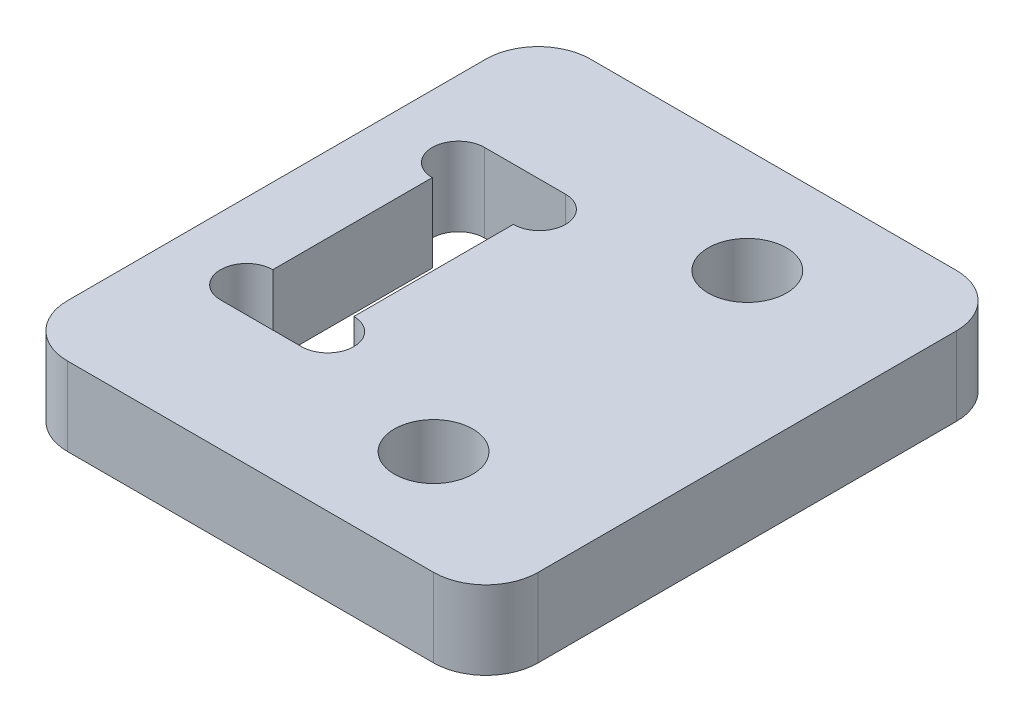
ISO-10303-21;
HEADER;
FILE_DESCRIPTION(('STEP AP214'),'2;1');
FILE_NAME('part.step','',(''),(''),'','','');
FILE_SCHEMA(('AUTOMOTIVE_DESIGN { 1 0 10303 214 1 1 1 1 }'));
ENDSEC;
DATA;
#1=APPLICATION_CONTEXT('core data for automotive mechanical design processes');
#2=APPLICATION_PROTOCOL_DEFINITION('international standard','automotive_design',2000,#1);
#3=PRODUCT_CONTEXT('',#1,'mechanical');
#4=PRODUCT('Part','Part','',(#3));
#5=PRODUCT_RELATED_PRODUCT_CATEGORY('part','',(#4));
#6=PRODUCT_DEFINITION_FORMATION('','',#4);
#7=PRODUCT_DEFINITION_CONTEXT('part definition',#1,'design');
#8=PRODUCT_DEFINITION('design','',#6,#7);
#9=PRODUCT_DEFINITION_SHAPE('','',#8);
#10=(LENGTH_UNIT() NAMED_UNIT(*) SI_UNIT(.MILLI.,.METRE.));
#11=(NAMED_UNIT(*) PLANE_ANGLE_UNIT() SI_UNIT($,.RADIAN.));
#12=(NAMED_UNIT(*) SI_UNIT($,.STERADIAN.) SOLID_ANGLE_UNIT());
#13=UNCERTAINTY_MEASURE_WITH_UNIT(LENGTH_MEASURE(1.E-05),#10,'distance_accuracy_value','');
#14=(GEOMETRIC_REPRESENTATION_CONTEXT(3) GLOBAL_UNCERTAINTY_ASSIGNED_CONTEXT((#13)) GLOBAL_UNIT_ASSIGNED_CONTEXT((#10,
#11,#12)) REPRESENTATION_CONTEXT('',''));
#15=CARTESIAN_POINT('',(0.,0.,0.));
#16=DIRECTION('',(0.,0.,1.));
#17=DIRECTION('',(1.,0.,0.));
#18=AXIS2_PLACEMENT_3D('',#15,#16,#17);
#19=CARTESIAN_POINT('',(0.,3.,5.05));
#20=DIRECTION('',(0.,0.,-1.));
#21=DIRECTION('',(-1.,0.,0.));
#22=AXIS2_PLACEMENT_3D('',#19,#20,#21);
#23=PLANE('',#22);
#24=DIRECTION('',(1.,0.,0.));
#25=VECTOR('',#24,1.);
#26=CARTESIAN_POINT('',(0.,0.,5.05));
#27=LINE('',#26,#25);
#28=CARTESIAN_POINT('',(-9.10000000000001,0.,5.05));
#29=VERTEX_POINT('',#28);
#30=CARTESIAN_POINT('',(-6.00000000000001,0.,5.05));
#31=VERTEX_POINT('',#30);
#32=EDGE_CURVE('E156',#29,#31,#27,.T.);
#33=ORIENTED_EDGE('',*,*,#32,.F.);
#34=DIRECTION('',(0.,-1.,0.));
#35=VECTOR('',#34,1.);
#36=CARTESIAN_POINT('',(-9.10000000000001,3.,5.05));
#37=LINE('',#36,#35);
#38=CARTESIAN_POINT('',(-9.10000000000001,3.,5.05));
#39=VERTEX_POINT('',#38);
#40=EDGE_CURVE('E150',#39,#29,#37,.T.);
#41=ORIENTED_EDGE('',*,*,#40,.F.);
#42=DIRECTION('',(1.,0.,0.));
#43=VECTOR('',#42,1.);
#44=CARTESIAN_POINT('',(0.,3.,5.05));
#45=LINE('',#44,#43);
#46=CARTESIAN_POINT('',(-6.00000000000001,3.,5.05));
#47=VERTEX_POINT('',#46);
#48=EDGE_CURVE('E153',#39,#47,#45,.T.);
#49=ORIENTED_EDGE('',*,*,#48,.T.);
#50=DIRECTION('',(0.,-1.,0.));
#51=VECTOR('',#50,1.);
#52=CARTESIAN_POINT('',(-6.00000000000001,3.,5.05));
#53=LINE('',#52,#51);
#54=EDGE_CURVE('E195',#47,#31,#53,.T.);
#55=ORIENTED_EDGE('',*,*,#54,.T.);
#56=EDGE_LOOP('',(#33,#41,#49,#55));
#57=FACE_BOUND('',#56,.T.);
#58=ADVANCED_FACE('F36',(#57),#23,.T.);
#59=CARTESIAN_POINT('',(-9.10000000000001,3.,4.05));
#60=DIRECTION('',(0.,-1.,0.));
#61=DIRECTION('',(0.,0.,-1.));
#62=AXIS2_PLACEMENT_3D('',#59,#60,#61);
#63=CYLINDRICAL_SURFACE('',#62,1.);
#64=CARTESIAN_POINT('',(-9.10000000000001,0.,4.05));
#65=DIRECTION('',(0.,1.,0.));
#66=DIRECTION('',(0.,0.,1.));
#67=AXIS2_PLACEMENT_3D('',#64,#65,#66);
#68=CIRCLE('',#67,1.);
#69=CARTESIAN_POINT('',(-9.10000000000001,0.,3.05));
#70=VERTEX_POINT('',#69);
#71=EDGE_CURVE('E215',#29,#70,#68,.F.);
#72=ORIENTED_EDGE('',*,*,#71,.T.);
#73=DIRECTION('',(0.,-1.,0.));
#74=VECTOR('',#73,1.);
#75=CARTESIAN_POINT('',(-9.10000000000001,3.,3.05));
#76=LINE('',#75,#74);
#77=CARTESIAN_POINT('',(-9.10000000000001,3.,3.05));
#78=VERTEX_POINT('',#77);
#79=EDGE_CURVE('E161',#78,#70,#76,.T.);
#80=ORIENTED_EDGE('',*,*,#79,.F.);
#81=CARTESIAN_POINT('',(-9.10000000000001,3.,4.05));
#82=DIRECTION('',(0.,1.,0.));
#83=DIRECTION('',(0.,0.,1.));
#84=AXIS2_PLACEMENT_3D('',#81,#82,#83);
#85=CIRCLE('',#84,1.);
#86=EDGE_CURVE('E165',#39,#78,#85,.F.);
#87=ORIENTED_EDGE('',*,*,#86,.F.);
#88=ORIENTED_EDGE('',*,*,#40,.T.);
#89=EDGE_LOOP('',(#72,#80,#87,#88));
#90=FACE_BOUND('',#89,.T.);
#91=ADVANCED_FACE('F166',(#90),#63,.F.);
#92=CARTESIAN_POINT('',(-9.10000000000001,3.,0.));
#93=DIRECTION('',(-1.,0.,0.));
#94=DIRECTION('',(0.,0.,1.));
#95=AXIS2_PLACEMENT_3D('',#92,#93,#94);
#96=PLANE('',#95);
#97=DIRECTION('',(0.,0.,-1.));
#98=VECTOR('',#97,1.);
#99=CARTESIAN_POINT('',(-9.10000000000001,0.,0.));
#100=LINE('',#99,#98);
#101=CARTESIAN_POINT('',(-9.10000000000001,0.,-3.05));
#102=VERTEX_POINT('',#101);
#103=EDGE_CURVE('E217',#70,#102,#100,.T.);
#104=ORIENTED_EDGE('',*,*,#103,.T.);
#105=DIRECTION('',(0.,-1.,0.));
#106=VECTOR('',#105,1.);
#107=CARTESIAN_POINT('',(-9.10000000000001,3.,-3.05));
#108=LINE('',#107,#106);
#109=CARTESIAN_POINT('',(-9.10000000000001,3.,-3.05));
#110=VERTEX_POINT('',#109);
#111=EDGE_CURVE('E246',#110,#102,#108,.T.);
#112=ORIENTED_EDGE('',*,*,#111,.F.);
#113=DIRECTION('',(0.,0.,-1.));
#114=VECTOR('',#113,1.);
#115=CARTESIAN_POINT('',(-9.10000000000001,3.,0.));
#116=LINE('',#115,#114);
#117=EDGE_CURVE('E169',#78,#110,#116,.T.);
#118=ORIENTED_EDGE('',*,*,#117,.F.);
#119=ORIENTED_EDGE('',*,*,#79,.T.);
#120=EDGE_LOOP('',(#104,#112,#118,#119));
#121=FACE_BOUND('',#120,.T.);
#122=ADVANCED_FACE('F343',(#121),#96,.F.);
#123=CARTESIAN_POINT('',(-9.10000000000001,3.,-4.05));
#124=DIRECTION('',(0.,-1.,0.));
#125=DIRECTION('',(0.,0.,-1.));
#126=AXIS2_PLACEMENT_3D('',#123,#124,#125);
#127=CYLINDRICAL_SURFACE('',#126,1.);
#128=CARTESIAN_POINT('',(-9.10000000000001,0.,-4.05));
#129=DIRECTION('',(0.,1.,0.));
#130=DIRECTION('',(0.,0.,1.));
#131=AXIS2_PLACEMENT_3D('',#128,#129,#130);
#132=CIRCLE('',#131,1.);
#133=CARTESIAN_POINT('',(-9.10000000000001,0.,-5.05));
#134=VERTEX_POINT('',#133);
#135=EDGE_CURVE('E220',#134,#102,#132,.T.);
#136=ORIENTED_EDGE('',*,*,#135,.F.);
#137=DIRECTION('',(0.,-1.,0.));
#138=VECTOR('',#137,1.);
#139=CARTESIAN_POINT('',(-9.10000000000001,3.,-5.05));
#140=LINE('',#139,#138);
#141=CARTESIAN_POINT('',(-9.10000000000001,3.,-5.05));
#142=VERTEX_POINT('',#141);
#143=EDGE_CURVE('E244',#142,#134,#140,.T.);
#144=ORIENTED_EDGE('',*,*,#143,.F.);
#145=CARTESIAN_POINT('',(-9.10000000000001,3.,-4.05));
#146=DIRECTION('',(0.,1.,0.));
#147=DIRECTION('',(0.,0.,1.));
#148=AXIS2_PLACEMENT_3D('',#145,#146,#147);
#149=CIRCLE('',#148,1.);
#150=EDGE_CURVE('E183',#142,#110,#149,.T.);
#151=ORIENTED_EDGE('',*,*,#150,.T.);
#152=ORIENTED_EDGE('',*,*,#111,.T.);
#153=EDGE_LOOP('',(#136,#144,#151,#152));
#154=FACE_BOUND('',#153,.T.);
#155=ADVANCED_FACE('F340',(#154),#127,.F.);
#156=CARTESIAN_POINT('',(0.,3.,-5.05));
#157=DIRECTION('',(0.,0.,-1.));
#158=DIRECTION('',(-1.,0.,0.));
#159=AXIS2_PLACEMENT_3D('',#156,#157,#158);
#160=PLANE('',#159);
#161=DIRECTION('',(1.,0.,0.));
#162=VECTOR('',#161,1.);
#163=CARTESIAN_POINT('',(0.,0.,-5.05));
#164=LINE('',#163,#162);
#165=CARTESIAN_POINT('',(-6.00000000000001,0.,-5.05));
#166=VERTEX_POINT('',#165);
#167=EDGE_CURVE('E223',#134,#166,#164,.T.);
#168=ORIENTED_EDGE('',*,*,#167,.T.);
#169=DIRECTION('',(0.,-1.,0.));
#170=VECTOR('',#169,1.);
#171=CARTESIAN_POINT('',(-6.00000000000001,3.,-5.05));
#172=LINE('',#171,#170);
#173=CARTESIAN_POINT('',(-6.00000000000001,3.,-5.05));
#174=VERTEX_POINT('',#173);
#175=EDGE_CURVE('E241',#174,#166,#172,.T.);
#176=ORIENTED_EDGE('',*,*,#175,.F.);
#177=DIRECTION('',(1.,0.,0.));
#178=VECTOR('',#177,1.);
#179=CARTESIAN_POINT('',(0.,3.,-5.05));
#180=LINE('',#179,#178);
#181=EDGE_CURVE('E186',#142,#174,#180,.T.);
#182=ORIENTED_EDGE('',*,*,#181,.F.);
#183=ORIENTED_EDGE('',*,*,#143,.T.);
#184=EDGE_LOOP('',(#168,#176,#182,#183));
#185=FACE_BOUND('',#184,.T.);
#186=ADVANCED_FACE('F337',(#185),#160,.F.);
#187=CARTESIAN_POINT('',(-6.00000000000001,3.,-4.05));
#188=DIRECTION('',(0.,-1.,0.));
#189=DIRECTION('',(0.,0.,-1.));
#190=AXIS2_PLACEMENT_3D('',#187,#188,#189);
#191=CYLINDRICAL_SURFACE('',#190,1.);
#192=CARTESIAN_POINT('',(-6.00000000000001,0.,-4.05));
#193=DIRECTION('',(0.,1.,0.));
#194=DIRECTION('',(0.,0.,1.));
#195=AXIS2_PLACEMENT_3D('',#192,#193,#194);
#196=CIRCLE('',#195,1.);
#197=CARTESIAN_POINT('',(-6.00000000000001,0.,-3.05));
#198=VERTEX_POINT('',#197);
#199=EDGE_CURVE('E226',#166,#198,#196,.F.);
#200=ORIENTED_EDGE('',*,*,#199,.T.);
#201=DIRECTION('',(0.,-1.,0.));
#202=VECTOR('',#201,1.);
#203=CARTESIAN_POINT('',(-6.00000000000001,3.,-3.05));
#204=LINE('',#203,#202);
#205=CARTESIAN_POINT('',(-6.00000000000001,3.,-3.05));
#206=VERTEX_POINT('',#205);
#207=EDGE_CURVE('E239',#206,#198,#204,.T.);
#208=ORIENTED_EDGE('',*,*,#207,.F.);
#209=CARTESIAN_POINT('',(-6.00000000000001,3.,-4.05));
#210=DIRECTION('',(0.,1.,0.));
#211=DIRECTION('',(0.,0.,1.));
#212=AXIS2_PLACEMENT_3D('',#209,#210,#211);
#213=CIRCLE('',#212,1.);
#214=EDGE_CURVE('E189',#174,#206,#213,.F.);
#215=ORIENTED_EDGE('',*,*,#214,.F.);
#216=ORIENTED_EDGE('',*,*,#175,.T.);
#217=EDGE_LOOP('',(#200,#208,#215,#216));
#218=FACE_BOUND('',#217,.T.);
#219=ADVANCED_FACE('F334',(#218),#191,.F.);
#220=CARTESIAN_POINT('',(-6.00000000000001,3.,0.));
#221=DIRECTION('',(-1.,0.,0.));
#222=DIRECTION('',(0.,0.,1.));
#223=AXIS2_PLACEMENT_3D('',#220,#221,#222);
#224=PLANE('',#223);
#225=DIRECTION('',(0.,0.,-1.));
#226=VECTOR('',#225,1.);
#227=CARTESIAN_POINT('',(-6.00000000000001,0.,0.));
#228=LINE('',#227,#226);
#229=CARTESIAN_POINT('',(-6.00000000000001,0.,3.05));
#230=VERTEX_POINT('',#229);
#231=EDGE_CURVE('E229',#230,#198,#228,.T.);
#232=ORIENTED_EDGE('',*,*,#231,.F.);
#233=DIRECTION('',(0.,-1.,0.));
#234=VECTOR('',#233,1.);
#235=CARTESIAN_POINT('',(-6.00000000000001,3.,3.05));
#236=LINE('',#235,#234);
#237=CARTESIAN_POINT('',(-6.00000000000001,3.,3.05));
#238=VERTEX_POINT('',#237);
#239=EDGE_CURVE('E237',#238,#230,#236,.T.);
#240=ORIENTED_EDGE('',*,*,#239,.F.);
#241=DIRECTION('',(0.,0.,-1.));
#242=VECTOR('',#241,1.);
#243=CARTESIAN_POINT('',(-6.00000000000001,3.,0.));
#244=LINE('',#243,#242);
#245=EDGE_CURVE('E191',#238,#206,#244,.T.);
#246=ORIENTED_EDGE('',*,*,#245,.T.);
#247=ORIENTED_EDGE('',*,*,#207,.T.);
#248=EDGE_LOOP('',(#232,#240,#246,#247));
#249=FACE_BOUND('',#248,.T.);
#250=ADVANCED_FACE('F328',(#249),#224,.T.);
#251=CARTESIAN_POINT('',(0.,3.,-10.));
#252=DIRECTION('',(0.,0.,1.));
#253=DIRECTION('',(1.,0.,0.));
#254=AXIS2_PLACEMENT_3D('',#251,#252,#253);
#255=PLANE('',#254);
#256=DIRECTION('',(-1.,0.,0.));
#257=VECTOR('',#256,1.);
#258=CARTESIAN_POINT('',(0.,3.,-10.));
#259=LINE('',#258,#257);
#260=CARTESIAN_POINT('',(4.,3.,-10.));
#261=VERTEX_POINT('',#260);
#262=CARTESIAN_POINT('',(-10.,3.,-10.));
#263=VERTEX_POINT('',#262);
#264=EDGE_CURVE('E235',#261,#263,#259,.T.);
#265=ORIENTED_EDGE('',*,*,#264,.F.);
#266=DIRECTION('',(0.,-1.,0.));
#267=VECTOR('',#266,1.);
#268=CARTESIAN_POINT('',(4.,3.,-10.));
#269=LINE('',#268,#267);
#270=CARTESIAN_POINT('',(4.,0.,-10.));
#271=VERTEX_POINT('',#270);
#272=EDGE_CURVE('E250',#261,#271,#269,.T.);
#273=ORIENTED_EDGE('',*,*,#272,.T.);
#274=DIRECTION('',(-1.,0.,0.));
#275=VECTOR('',#274,1.);
#276=CARTESIAN_POINT('',(0.,0.,-10.));
#277=LINE('',#276,#275);
#278=CARTESIAN_POINT('',(-10.,0.,-10.));
#279=VERTEX_POINT('',#278);
#280=EDGE_CURVE('E196',#271,#279,#277,.T.);
#281=ORIENTED_EDGE('',*,*,#280,.T.);
#282=DIRECTION('',(0.,-1.,0.));
#283=VECTOR('',#282,1.);
#284=CARTESIAN_POINT('',(-10.,3.,-10.));
#285=LINE('',#284,#283);
#286=EDGE_CURVE('E160',#279,#263,#285,.F.);
#287=ORIENTED_EDGE('',*,*,#286,.T.);
#288=EDGE_LOOP('',(#265,#273,#281,#287));
#289=FACE_BOUND('',#288,.T.);
#290=ADVANCED_FACE('F367',(#289),#255,.F.);
#291=CARTESIAN_POINT('',(-12.,3.,0.));
#292=DIRECTION('',(1.,0.,0.));
#293=DIRECTION('',(0.,0.,-1.));
#294=AXIS2_PLACEMENT_3D('',#291,#292,#293);
#295=PLANE('',#294);
#296=DIRECTION('',(0.,0.,1.));
#297=VECTOR('',#296,1.);
#298=CARTESIAN_POINT('',(-12.,0.,0.));
#299=LINE('',#298,#297);
#300=CARTESIAN_POINT('',(-12.,0.,-8.));
#301=VERTEX_POINT('',#300);
#302=CARTESIAN_POINT('',(-12.,0.,8.));
#303=VERTEX_POINT('',#302);
#304=EDGE_CURVE('E199',#301,#303,#299,.T.);
#305=ORIENTED_EDGE('',*,*,#304,.T.);
#306=DIRECTION('',(0.,-1.,0.));
#307=VECTOR('',#306,1.);
#308=CARTESIAN_POINT('',(-12.,3.,8.));
#309=LINE('',#308,#307);
#310=CARTESIAN_POINT('',(-12.,3.,8.));
#311=VERTEX_POINT('',#310);
#312=EDGE_CURVE('E11',#303,#311,#309,.F.);
#313=ORIENTED_EDGE('',*,*,#312,.T.);
#314=DIRECTION('',(0.,0.,1.));
#315=VECTOR('',#314,1.);
#316=CARTESIAN_POINT('',(-12.,3.,0.));
#317=LINE('',#316,#315);
#318=CARTESIAN_POINT('',(-12.,3.,-8.));
#319=VERTEX_POINT('',#318);
#320=EDGE_CURVE('E283',#319,#311,#317,.T.);
#321=ORIENTED_EDGE('',*,*,#320,.F.);
#322=DIRECTION('',(0.,-1.,0.));
#323=VECTOR('',#322,1.);
#324=CARTESIAN_POINT('',(-12.,3.,-8.));
#325=LINE('',#324,#323);
#326=EDGE_CURVE('E44',#319,#301,#325,.T.);
#327=ORIENTED_EDGE('',*,*,#326,.T.);
#328=EDGE_LOOP('',(#305,#313,#321,#327));
#329=FACE_BOUND('',#328,.T.);
#330=ADVANCED_FACE('F281',(#329),#295,.F.);
#331=CARTESIAN_POINT('',(0.,3.,10.));
#332=DIRECTION('',(0.,0.,1.));
#333=DIRECTION('',(1.,0.,0.));
#334=AXIS2_PLACEMENT_3D('',#331,#332,#333);
#335=PLANE('',#334);
#336=DIRECTION('',(-1.,0.,0.));
#337=VECTOR('',#336,1.);
#338=CARTESIAN_POINT('',(0.,0.,10.));
#339=LINE('',#338,#337);
#340=CARTESIAN_POINT('',(4.,0.,10.));
#341=VERTEX_POINT('',#340);
#342=CARTESIAN_POINT('',(-10.,0.,10.));
#343=VERTEX_POINT('',#342);
#344=EDGE_CURVE('E202',#341,#343,#339,.T.);
#345=ORIENTED_EDGE('',*,*,#344,.F.);
#346=DIRECTION('',(0.,-1.,0.));
#347=VECTOR('',#346,1.);
#348=CARTESIAN_POINT('',(4.,3.,10.));
#349=LINE('',#348,#347);
#350=CARTESIAN_POINT('',(4.,3.,10.));
#351=VERTEX_POINT('',#350);
#352=EDGE_CURVE('E58',#341,#351,#349,.F.);
#353=ORIENTED_EDGE('',*,*,#352,.T.);
#354=DIRECTION('',(-1.,0.,0.));
#355=VECTOR('',#354,1.);
#356=CARTESIAN_POINT('',(0.,3.,10.));
#357=LINE('',#356,#355);
#358=CARTESIAN_POINT('',(-10.,3.,10.));
#359=VERTEX_POINT('',#358);
#360=EDGE_CURVE('E294',#351,#359,#357,.T.);
#361=ORIENTED_EDGE('',*,*,#360,.T.);
#362=DIRECTION('',(0.,-1.,0.));
#363=VECTOR('',#362,1.);
#364=CARTESIAN_POINT('',(-10.,0.,10.));
#365=LINE('',#364,#363);
#366=EDGE_CURVE('E273',#359,#343,#365,.T.);
#367=ORIENTED_EDGE('',*,*,#366,.T.);
#368=EDGE_LOOP('',(#345,#353,#361,#367));
#369=FACE_BOUND('',#368,.T.);
#370=ADVANCED_FACE('F293',(#369),#335,.T.);
#371=CARTESIAN_POINT('',(0.,3.,6.));
#372=DIRECTION('',(0.,-1.,0.));
#373=DIRECTION('',(0.,0.,-1.));
#374=AXIS2_PLACEMENT_3D('',#371,#372,#373);
#375=CYLINDRICAL_SURFACE('',#374,1.5);
#376=CARTESIAN_POINT('',(0.,3.,6.));
#377=DIRECTION('',(0.,1.,0.));
#378=DIRECTION('',(0.,0.,1.));
#379=AXIS2_PLACEMENT_3D('',#376,#377,#378);
#380=CIRCLE('',#379,1.5);
#381=CARTESIAN_POINT('',(0.,3.,7.5));
#382=VERTEX_POINT('',#381);
#383=EDGE_CURVE('E175',#382,#382,#380,.F.);
#384=ORIENTED_EDGE('',*,*,#383,.F.);
#385=EDGE_LOOP('',(#384));
#386=FACE_BOUND('',#385,.T.);
#387=CARTESIAN_POINT('',(0.,0.,6.));
#388=DIRECTION('',(0.,1.,0.));
#389=DIRECTION('',(0.,0.,1.));
#390=AXIS2_PLACEMENT_3D('',#387,#388,#389);
#391=CIRCLE('',#390,1.5);
#392=CARTESIAN_POINT('',(0.,0.,7.5));
#393=VERTEX_POINT('',#392);
#394=EDGE_CURVE('E211',#393,#393,#391,.F.);
#395=ORIENTED_EDGE('',*,*,#394,.T.);
#396=EDGE_LOOP('',(#395));
#397=FACE_BOUND('',#396,.T.);
#398=ADVANCED_FACE('F314',(#386,#397),#375,.F.);
#399=CARTESIAN_POINT('',(0.,3.,-6.));
#400=DIRECTION('',(0.,-1.,0.));
#401=DIRECTION('',(0.,0.,-1.));
#402=AXIS2_PLACEMENT_3D('',#399,#400,#401);
#403=CYLINDRICAL_SURFACE('',#402,1.5);
#404=CARTESIAN_POINT('',(0.,3.,-6.));
#405=DIRECTION('',(0.,1.,0.));
#406=DIRECTION('',(0.,0.,1.));
#407=AXIS2_PLACEMENT_3D('',#404,#405,#406);
#408=CIRCLE('',#407,1.5);
#409=CARTESIAN_POINT('',(0.,3.,-4.5));
#410=VERTEX_POINT('',#409);
#411=EDGE_CURVE('E178',#410,#410,#408,.T.);
#412=ORIENTED_EDGE('',*,*,#411,.T.);
#413=EDGE_LOOP('',(#412));
#414=FACE_BOUND('',#413,.T.);
#415=CARTESIAN_POINT('',(0.,0.,-6.));
#416=DIRECTION('',(0.,1.,0.));
#417=DIRECTION('',(0.,0.,1.));
#418=AXIS2_PLACEMENT_3D('',#415,#416,#417);
#419=CIRCLE('',#418,1.5);
#420=CARTESIAN_POINT('',(0.,0.,-4.5));
#421=VERTEX_POINT('',#420);
#422=EDGE_CURVE('E208',#421,#421,#419,.T.);
#423=ORIENTED_EDGE('',*,*,#422,.F.);
#424=EDGE_LOOP('',(#423));
#425=FACE_BOUND('',#424,.T.);
#426=ADVANCED_FACE('F305',(#414,#425),#403,.F.);
#427=CARTESIAN_POINT('',(6.,3.,0.));
#428=DIRECTION('',(-1.,0.,0.));
#429=DIRECTION('',(0.,0.,1.));
#430=AXIS2_PLACEMENT_3D('',#427,#428,#429);
#431=PLANE('',#430);
#432=DIRECTION('',(0.,0.,-1.));
#433=VECTOR('',#432,1.);
#434=CARTESIAN_POINT('',(6.,0.,0.));
#435=LINE('',#434,#433);
#436=CARTESIAN_POINT('',(6.,0.,8.));
#437=VERTEX_POINT('',#436);
#438=CARTESIAN_POINT('',(6.,0.,-8.));
#439=VERTEX_POINT('',#438);
#440=EDGE_CURVE('E205',#437,#439,#435,.T.);
#441=ORIENTED_EDGE('',*,*,#440,.T.);
#442=DIRECTION('',(0.,-1.,0.));
#443=VECTOR('',#442,1.);
#444=CARTESIAN_POINT('',(6.,3.,-8.));
#445=LINE('',#444,#443);
#446=CARTESIAN_POINT('',(6.,3.,-8.));
#447=VERTEX_POINT('',#446);
#448=EDGE_CURVE('E264',#439,#447,#445,.F.);
#449=ORIENTED_EDGE('',*,*,#448,.T.);
#450=DIRECTION('',(0.,0.,-1.));
#451=VECTOR('',#450,1.);
#452=CARTESIAN_POINT('',(6.,3.,0.));
#453=LINE('',#452,#451);
#454=CARTESIAN_POINT('',(6.,3.,8.));
#455=VERTEX_POINT('',#454);
#456=EDGE_CURVE('E296',#455,#447,#453,.T.);
#457=ORIENTED_EDGE('',*,*,#456,.F.);
#458=DIRECTION('',(0.,-1.,0.));
#459=VECTOR('',#458,1.);
#460=CARTESIAN_POINT('',(6.,0.,8.));
#461=LINE('',#460,#459);
#462=EDGE_CURVE('E261',#455,#437,#461,.T.);
#463=ORIENTED_EDGE('',*,*,#462,.T.);
#464=EDGE_LOOP('',(#441,#449,#457,#463));
#465=FACE_BOUND('',#464,.T.);
#466=ADVANCED_FACE('F359',(#465),#431,.F.);
#467=CARTESIAN_POINT('',(-6.00000000000001,3.,4.05));
#468=DIRECTION('',(0.,-1.,0.));
#469=DIRECTION('',(0.,0.,-1.));
#470=AXIS2_PLACEMENT_3D('',#467,#468,#469);
#471=CYLINDRICAL_SURFACE('',#470,1.);
#472=CARTESIAN_POINT('',(-6.00000000000001,0.,4.05));
#473=DIRECTION('',(0.,1.,0.));
#474=DIRECTION('',(0.,0.,1.));
#475=AXIS2_PLACEMENT_3D('',#472,#473,#474);
#476=CIRCLE('',#475,1.);
#477=EDGE_CURVE('E232',#31,#230,#476,.T.);
#478=ORIENTED_EDGE('',*,*,#477,.F.);
#479=ORIENTED_EDGE('',*,*,#54,.F.);
#480=CARTESIAN_POINT('',(-6.00000000000001,3.,4.05));
#481=DIRECTION('',(0.,1.,0.));
#482=DIRECTION('',(0.,0.,1.));
#483=AXIS2_PLACEMENT_3D('',#480,#481,#482);
#484=CIRCLE('',#483,1.);
#485=EDGE_CURVE('E174',#47,#238,#484,.T.);
#486=ORIENTED_EDGE('',*,*,#485,.T.);
#487=ORIENTED_EDGE('',*,*,#239,.T.);
#488=EDGE_LOOP('',(#478,#479,#486,#487));
#489=FACE_BOUND('',#488,.T.);
#490=ADVANCED_FACE('F310',(#489),#471,.F.);
#491=CARTESIAN_POINT('',(0.,3.,0.));
#492=DIRECTION('',(0.,1.,0.));
#493=DIRECTION('',(0.,0.,1.));
#494=AXIS2_PLACEMENT_3D('',#491,#492,#493);
#495=PLANE('',#494);
#496=ORIENTED_EDGE('',*,*,#456,.T.);
#497=CARTESIAN_POINT('',(4.,3.,-8.));
#498=DIRECTION('',(0.,1.,0.));
#499=DIRECTION('',(0.,0.,1.));
#500=AXIS2_PLACEMENT_3D('',#497,#498,#499);
#501=CIRCLE('',#500,2.);
#502=EDGE_CURVE('E271',#447,#261,#501,.T.);
#503=ORIENTED_EDGE('',*,*,#502,.T.);
#504=ORIENTED_EDGE('',*,*,#264,.T.);
#505=CARTESIAN_POINT('',(-10.,3.,-8.));
#506=DIRECTION('',(0.,1.,0.));
#507=DIRECTION('',(0.,0.,1.));
#508=AXIS2_PLACEMENT_3D('',#505,#506,#507);
#509=CIRCLE('',#508,2.);
#510=EDGE_CURVE('E266',#263,#319,#509,.T.);
#511=ORIENTED_EDGE('',*,*,#510,.T.);
#512=ORIENTED_EDGE('',*,*,#320,.T.);
#513=CARTESIAN_POINT('',(-10.,3.,8.));
#514=DIRECTION('',(0.,1.,0.));
#515=DIRECTION('',(0.,0.,1.));
#516=AXIS2_PLACEMENT_3D('',#513,#514,#515);
#517=CIRCLE('',#516,2.);
#518=EDGE_CURVE('E51',#311,#359,#517,.T.);
#519=ORIENTED_EDGE('',*,*,#518,.T.);
#520=ORIENTED_EDGE('',*,*,#360,.F.);
#521=CARTESIAN_POINT('',(4.,3.,8.));
#522=DIRECTION('',(0.,1.,0.));
#523=DIRECTION('',(0.,0.,1.));
#524=AXIS2_PLACEMENT_3D('',#521,#522,#523);
#525=CIRCLE('',#524,2.);
#526=EDGE_CURVE('E269',#351,#455,#525,.T.);
#527=ORIENTED_EDGE('',*,*,#526,.T.);
#528=EDGE_LOOP('',(#496,#503,#504,#511,#512,#519,#520,#527));
#529=FACE_BOUND('',#528,.T.);
#530=ORIENTED_EDGE('',*,*,#411,.F.);
#531=EDGE_LOOP('',(#530));
#532=FACE_BOUND('',#531,.T.);
#533=ORIENTED_EDGE('',*,*,#383,.T.);
#534=EDGE_LOOP('',(#533));
#535=FACE_BOUND('',#534,.T.);
#536=ORIENTED_EDGE('',*,*,#48,.F.);
#537=ORIENTED_EDGE('',*,*,#86,.T.);
#538=ORIENTED_EDGE('',*,*,#117,.T.);
#539=ORIENTED_EDGE('',*,*,#150,.F.);
#540=ORIENTED_EDGE('',*,*,#181,.T.);
#541=ORIENTED_EDGE('',*,*,#214,.T.);
#542=ORIENTED_EDGE('',*,*,#245,.F.);
#543=ORIENTED_EDGE('',*,*,#485,.F.);
#544=EDGE_LOOP('',(#536,#537,#538,#539,#540,#541,#542,#543));
#545=FACE_BOUND('',#544,.T.);
#546=ADVANCED_FACE('F171',(#529,#532,#535,#545),#495,.T.);
#547=CARTESIAN_POINT('',(0.,0.,0.));
#548=DIRECTION('',(0.,1.,0.));
#549=DIRECTION('',(0.,0.,1.));
#550=AXIS2_PLACEMENT_3D('',#547,#548,#549);
#551=PLANE('',#550);
#552=ORIENTED_EDGE('',*,*,#280,.F.);
#553=CARTESIAN_POINT('',(4.,0.,-8.));
#554=DIRECTION('',(0.,1.,0.));
#555=DIRECTION('',(0.,0.,1.));
#556=AXIS2_PLACEMENT_3D('',#553,#554,#555);
#557=CIRCLE('',#556,2.);
#558=EDGE_CURVE('E259',#271,#439,#557,.F.);
#559=ORIENTED_EDGE('',*,*,#558,.T.);
#560=ORIENTED_EDGE('',*,*,#440,.F.);
#561=CARTESIAN_POINT('',(4.,0.,8.));
#562=DIRECTION('',(0.,1.,0.));
#563=DIRECTION('',(0.,0.,1.));
#564=AXIS2_PLACEMENT_3D('',#561,#562,#563);
#565=CIRCLE('',#564,2.);
#566=EDGE_CURVE('E257',#437,#341,#565,.F.);
#567=ORIENTED_EDGE('',*,*,#566,.T.);
#568=ORIENTED_EDGE('',*,*,#344,.T.);
#569=CARTESIAN_POINT('',(-10.,0.,8.));
#570=DIRECTION('',(0.,1.,0.));
#571=DIRECTION('',(0.,0.,1.));
#572=AXIS2_PLACEMENT_3D('',#569,#570,#571);
#573=CIRCLE('',#572,2.);
#574=EDGE_CURVE('E255',#343,#303,#573,.F.);
#575=ORIENTED_EDGE('',*,*,#574,.T.);
#576=ORIENTED_EDGE('',*,*,#304,.F.);
#577=CARTESIAN_POINT('',(-10.,0.,-8.));
#578=DIRECTION('',(0.,1.,0.));
#579=DIRECTION('',(0.,0.,1.));
#580=AXIS2_PLACEMENT_3D('',#577,#578,#579);
#581=CIRCLE('',#580,2.);
#582=EDGE_CURVE('E253',#301,#279,#581,.F.);
#583=ORIENTED_EDGE('',*,*,#582,.T.);
#584=EDGE_LOOP('',(#552,#559,#560,#567,#568,#575,#576,#583));
#585=FACE_BOUND('',#584,.T.);
#586=ORIENTED_EDGE('',*,*,#422,.T.);
#587=EDGE_LOOP('',(#586));
#588=FACE_BOUND('',#587,.T.);
#589=ORIENTED_EDGE('',*,*,#394,.F.);
#590=EDGE_LOOP('',(#589));
#591=FACE_BOUND('',#590,.T.);
#592=ORIENTED_EDGE('',*,*,#32,.T.);
#593=ORIENTED_EDGE('',*,*,#477,.T.);
#594=ORIENTED_EDGE('',*,*,#231,.T.);
#595=ORIENTED_EDGE('',*,*,#199,.F.);
#596=ORIENTED_EDGE('',*,*,#167,.F.);
#597=ORIENTED_EDGE('',*,*,#135,.T.);
#598=ORIENTED_EDGE('',*,*,#103,.F.);
#599=ORIENTED_EDGE('',*,*,#71,.F.);
#600=EDGE_LOOP('',(#592,#593,#594,#595,#596,#597,#598,#599));
#601=FACE_BOUND('',#600,.T.);
#602=ADVANCED_FACE('F288',(#585,#588,#591,#601),#551,.F.);
#603=CARTESIAN_POINT('',(4.,3.,-8.));
#604=DIRECTION('',(0.,-1.,0.));
#605=DIRECTION('',(0.,0.,-1.));
#606=AXIS2_PLACEMENT_3D('',#603,#604,#605);
#607=CYLINDRICAL_SURFACE('',#606,2.);
#608=ORIENTED_EDGE('',*,*,#502,.F.);
#609=ORIENTED_EDGE('',*,*,#448,.F.);
#610=ORIENTED_EDGE('',*,*,#558,.F.);
#611=ORIENTED_EDGE('',*,*,#272,.F.);
#612=EDGE_LOOP('',(#608,#609,#610,#611));
#613=FACE_BOUND('',#612,.T.);
#614=ADVANCED_FACE('F322',(#613),#607,.T.);
#615=CARTESIAN_POINT('',(4.,3.,8.));
#616=DIRECTION('',(0.,1.,0.));
#617=DIRECTION('',(0.,0.,1.));
#618=AXIS2_PLACEMENT_3D('',#615,#616,#617);
#619=CYLINDRICAL_SURFACE('',#618,2.);
#620=ORIENTED_EDGE('',*,*,#526,.F.);
#621=ORIENTED_EDGE('',*,*,#352,.F.);
#622=ORIENTED_EDGE('',*,*,#566,.F.);
#623=ORIENTED_EDGE('',*,*,#462,.F.);
#624=EDGE_LOOP('',(#620,#621,#622,#623));
#625=FACE_BOUND('',#624,.T.);
#626=ADVANCED_FACE('F373',(#625),#619,.T.);
#627=CARTESIAN_POINT('',(-10.,3.,8.));
#628=DIRECTION('',(0.,1.,0.));
#629=DIRECTION('',(0.,0.,1.));
#630=AXIS2_PLACEMENT_3D('',#627,#628,#629);
#631=CYLINDRICAL_SURFACE('',#630,2.);
#632=ORIENTED_EDGE('',*,*,#518,.F.);
#633=ORIENTED_EDGE('',*,*,#312,.F.);
#634=ORIENTED_EDGE('',*,*,#574,.F.);
#635=ORIENTED_EDGE('',*,*,#366,.F.);
#636=EDGE_LOOP('',(#632,#633,#634,#635));
#637=FACE_BOUND('',#636,.T.);
#638=ADVANCED_FACE('F292',(#637),#631,.T.);
#639=CARTESIAN_POINT('',(-10.,3.,-8.));
#640=DIRECTION('',(0.,-1.,0.));
#641=DIRECTION('',(0.,0.,-1.));
#642=AXIS2_PLACEMENT_3D('',#639,#640,#641);
#643=CYLINDRICAL_SURFACE('',#642,2.);
#644=ORIENTED_EDGE('',*,*,#510,.F.);
#645=ORIENTED_EDGE('',*,*,#286,.F.);
#646=ORIENTED_EDGE('',*,*,#582,.F.);
#647=ORIENTED_EDGE('',*,*,#326,.F.);
#648=EDGE_LOOP('',(#644,#645,#646,#647));
#649=FACE_BOUND('',#648,.T.);
#650=ADVANCED_FACE('F38',(#649),#643,.T.);
#651=CLOSED_SHELL('',(#58,#91,#122,#155,#186,#219,#250,#290,#330,#370,#398,#426,#466,#490,#546,
#602,#614,#626,#638,#650));
#652=MANIFOLD_SOLID_BREP('B2',#651);
#653=ADVANCED_BREP_SHAPE_REPRESENTATION('',(#18,#652),#14);
#654=SHAPE_DEFINITION_REPRESENTATION(#9,#653);
ENDSEC;
END-ISO-10303-21;
